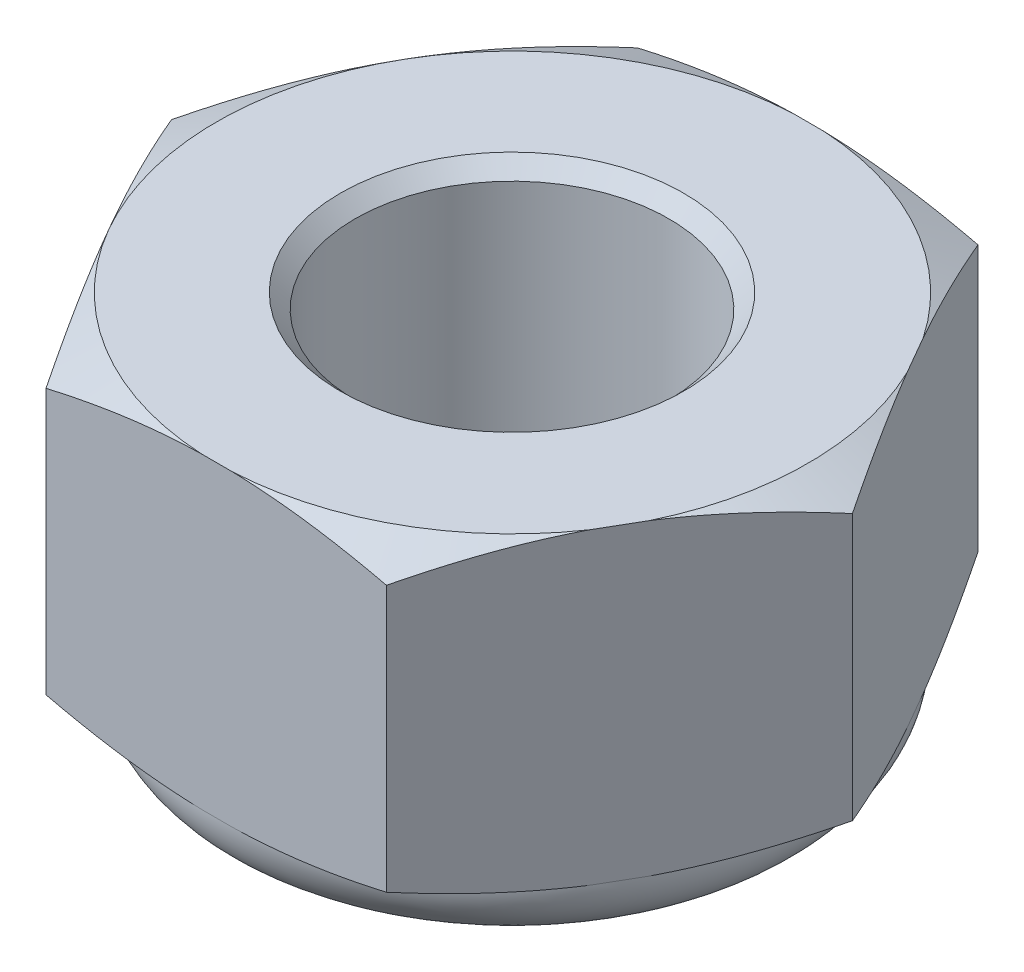
ISO-10303-21;
HEADER;
FILE_DESCRIPTION(('STEP AP214'),'2;1');
FILE_NAME('part.step','',(''),(''),'','','');
FILE_SCHEMA(('AUTOMOTIVE_DESIGN { 1 0 10303 214 1 1 1 1 }'));
ENDSEC;
DATA;
#1=APPLICATION_CONTEXT('core data for automotive mechanical design processes');
#2=APPLICATION_PROTOCOL_DEFINITION('international standard','automotive_design',2000,#1);
#3=PRODUCT_CONTEXT('',#1,'mechanical');
#4=PRODUCT('Part','Part','',(#3));
#5=PRODUCT_RELATED_PRODUCT_CATEGORY('part','',(#4));
#6=PRODUCT_DEFINITION_FORMATION('','',#4);
#7=PRODUCT_DEFINITION_CONTEXT('part definition',#1,'design');
#8=PRODUCT_DEFINITION('design','',#6,#7);
#9=PRODUCT_DEFINITION_SHAPE('','',#8);
#10=(LENGTH_UNIT() NAMED_UNIT(*) SI_UNIT(.MILLI.,.METRE.));
#11=(NAMED_UNIT(*) PLANE_ANGLE_UNIT() SI_UNIT($,.RADIAN.));
#12=(NAMED_UNIT(*) SI_UNIT($,.STERADIAN.) SOLID_ANGLE_UNIT());
#13=UNCERTAINTY_MEASURE_WITH_UNIT(LENGTH_MEASURE(1.E-05),#10,'distance_accuracy_value','');
#14=(GEOMETRIC_REPRESENTATION_CONTEXT(3) GLOBAL_UNCERTAINTY_ASSIGNED_CONTEXT((#13)) GLOBAL_UNIT_ASSIGNED_CONTEXT((#10,
#11,#12)) REPRESENTATION_CONTEXT('',''));
#15=CARTESIAN_POINT('',(0.,0.,0.));
#16=DIRECTION('',(0.,0.,1.));
#17=DIRECTION('',(1.,0.,0.));
#18=AXIS2_PLACEMENT_3D('',#15,#16,#17);
#19=CARTESIAN_POINT('',(2.42028619368284E-13,-0.5,-4.61852778244065E-13));
#20=DIRECTION('',(0.,-1.,0.));
#21=DIRECTION('',(1.,0.,0.));
#22=AXIS2_PLACEMENT_3D('',#19,#20,#21);
#23=CONICAL_SURFACE('',#22,2.22500000000005,0.785398163397449);
#24=CARTESIAN_POINT('',(2.42028619368284E-13,-0.4,-4.61852778244065E-13));
#25=DIRECTION('',(0.,1.,0.));
#26=DIRECTION('',(1.,0.,0.));
#27=AXIS2_PLACEMENT_3D('',#24,#25,#26);
#28=CIRCLE('',#27,2.12500000000005);
#29=CARTESIAN_POINT('',(-2.12499999999981,-0.4,-4.61592540799246E-13));
#30=VERTEX_POINT('',#29);
#31=EDGE_CURVE('E11',#30,#30,#28,.T.);
#32=ORIENTED_EDGE('',*,*,#31,.T.);
#33=EDGE_LOOP('',(#32));
#34=FACE_BOUND('',#33,.T.);
#35=CARTESIAN_POINT('',(2.42028619368284E-13,-0.6,-4.61852778244065E-13));
#36=DIRECTION('',(0.,-1.,0.));
#37=DIRECTION('',(1.,0.,0.));
#38=AXIS2_PLACEMENT_3D('',#35,#36,#37);
#39=CIRCLE('',#38,2.32500000000005);
#40=CARTESIAN_POINT('',(-2.3249999999998,-0.6,-4.62137508624867E-13));
#41=VERTEX_POINT('',#40);
#42=EDGE_CURVE('E27',#41,#41,#39,.T.);
#43=ORIENTED_EDGE('',*,*,#42,.T.);
#44=EDGE_LOOP('',(#43));
#45=FACE_BOUND('',#44,.T.);
#46=ADVANCED_FACE('F16',(#34,#45),#23,.F.);
#47=CARTESIAN_POINT('',(2.42028619368284E-13,0.,-4.61852778244065E-13));
#48=DIRECTION('',(0.,-1.,0.));
#49=DIRECTION('',(1.,0.,0.));
#50=AXIS2_PLACEMENT_3D('',#47,#48,#49);
#51=CYLINDRICAL_SURFACE('',#50,2.12500000000005);
#52=CARTESIAN_POINT('',(2.42028619368284E-13,3.97,-4.61852778244065E-13));
#53=DIRECTION('',(0.,-1.,0.));
#54=DIRECTION('',(1.,0.,0.));
#55=AXIS2_PLACEMENT_3D('',#52,#53,#54);
#56=CIRCLE('',#55,2.12500000000005);
#57=CARTESIAN_POINT('',(-2.12499999999981,3.97,-4.62113015688884E-13));
#58=VERTEX_POINT('',#57);
#59=EDGE_CURVE('E265',#58,#58,#56,.T.);
#60=ORIENTED_EDGE('',*,*,#59,.F.);
#61=EDGE_LOOP('',(#60));
#62=FACE_BOUND('',#61,.T.);
#63=ORIENTED_EDGE('',*,*,#31,.F.);
#64=EDGE_LOOP('',(#63));
#65=FACE_BOUND('',#64,.T.);
#66=ADVANCED_FACE('F496',(#62,#65),#51,.F.);
#67=CARTESIAN_POINT('',(1.53329039358869E-13,-0.6,-4.97397371368949E-13));
#68=DIRECTION('',(0.,1.,0.));
#69=DIRECTION('',(0.,0.,1.));
#70=AXIS2_PLACEMENT_3D('',#67,#68,#69);
#71=PLANE('',#70);
#72=CARTESIAN_POINT('',(1.53210777398272E-13,-0.6,-4.9737991503207E-13));
#73=DIRECTION('',(0.,1.,0.));
#74=DIRECTION('',(1.,0.,0.));
#75=AXIS2_PLACEMENT_3D('',#72,#73,#74);
#76=CIRCLE('',#75,2.64999999999992);
#77=CARTESIAN_POINT('',(-2.64999999999976,-0.6,-4.97055383630296E-13));
#78=VERTEX_POINT('',#77);
#79=EDGE_CURVE('E254',#78,#78,#76,.T.);
#80=ORIENTED_EDGE('',*,*,#79,.F.);
#81=EDGE_LOOP('',(#80));
#82=FACE_BOUND('',#81,.T.);
#83=ORIENTED_EDGE('',*,*,#42,.F.);
#84=EDGE_LOOP('',(#83));
#85=FACE_BOUND('',#84,.T.);
#86=ADVANCED_FACE('F501',(#82,#85),#71,.F.);
#87=CARTESIAN_POINT('',(2.42028619368284E-13,4.07,-4.61852778244065E-13));
#88=DIRECTION('',(0.,1.,0.));
#89=DIRECTION('',(1.,0.,0.));
#90=AXIS2_PLACEMENT_3D('',#87,#88,#89);
#91=CONICAL_SURFACE('',#90,2.22500000000005,0.785398163397448);
#92=ORIENTED_EDGE('',*,*,#59,.T.);
#93=EDGE_LOOP('',(#92));
#94=FACE_BOUND('',#93,.T.);
#95=CARTESIAN_POINT('',(2.42028619368284E-13,4.17,-4.61852778244065E-13));
#96=DIRECTION('',(0.,1.,0.));
#97=DIRECTION('',(1.,0.,0.));
#98=AXIS2_PLACEMENT_3D('',#95,#96,#97);
#99=CIRCLE('',#98,2.32500000000005);
#100=CARTESIAN_POINT('',(-2.3249999999998,4.17,-4.61568047863263E-13));
#101=VERTEX_POINT('',#100);
#102=EDGE_CURVE('E261',#101,#101,#99,.T.);
#103=ORIENTED_EDGE('',*,*,#102,.T.);
#104=EDGE_LOOP('',(#103));
#105=FACE_BOUND('',#104,.T.);
#106=ADVANCED_FACE('F788',(#94,#105),#91,.F.);
#107=CARTESIAN_POINT('',(-3.95168422103907,4.17,-0.00623584935142605));
#108=DIRECTION('',(0.,1.,0.));
#109=DIRECTION('',(0.,0.,1.));
#110=AXIS2_PLACEMENT_3D('',#107,#108,#109);
#111=PLANE('',#110);
#112=CARTESIAN_POINT('',(0.00631208491232327,4.17,0.));
#113=DIRECTION('',(0.,1.,0.));
#114=DIRECTION('',(-1.,0.,0.));
#115=AXIS2_PLACEMENT_3D('',#112,#113,#114);
#116=CIRCLE('',#115,4.00534598764084);
#117=CARTESIAN_POINT('',(-3.465683941561,4.17,1.99725930299725));
#118=VERTEX_POINT('',#117);
#119=CARTESIAN_POINT('',(-0.206680177830518,4.17,3.99967883419684));
#120=VERTEX_POINT('',#119);
#121=EDGE_CURVE('E266',#118,#120,#116,.T.);
#122=ORIENTED_EDGE('',*,*,#121,.T.);
#123=DIRECTION('',(0.999998754923727,0.,0.00157802122802851));
#124=VECTOR('',#123,1.);
#125=CARTESIAN_POINT('',(-2.3157102862899,4.17,3.99635073577141));
#126=LINE('',#125,#124);
#127=CARTESIAN_POINT('',(0.206680146394848,4.17,4.00033112637545));
#128=VERTEX_POINT('',#127);
#129=EDGE_CURVE('E539',#120,#128,#126,.T.);
#130=ORIENTED_EDGE('',*,*,#129,.T.);
#131=CARTESIAN_POINT('',(0.00631208491232327,4.17,0.));
#132=DIRECTION('',(0.,1.,0.));
#133=DIRECTION('',(-1.,0.,0.));
#134=AXIS2_PLACEMENT_3D('',#131,#132,#133);
#135=CIRCLE('',#134,4.00534598764084);
#136=CARTESIAN_POINT('',(3.31510741865947,4.17,2.25713755010271));
#137=VERTEX_POINT('',#136);
#138=EDGE_CURVE('E228',#128,#137,#135,.T.);
#139=ORIENTED_EDGE('',*,*,#138,.T.);
#140=DIRECTION('',(0.501365983932784,0.,-0.865235314902895));
#141=VECTOR('',#140,1.);
#142=CARTESIAN_POINT('',(2.30308611646648,4.17,4.00363930361773));
#143=LINE('',#142,#141);
#144=CARTESIAN_POINT('',(3.60994841098794,4.17,1.74831396210715));
#145=VERTEX_POINT('',#144);
#146=EDGE_CURVE('E173',#137,#145,#143,.T.);
#147=ORIENTED_EDGE('',*,*,#146,.T.);
#148=CARTESIAN_POINT('',(0.00631208491232327,4.17,0.));
#149=DIRECTION('',(0.,1.,0.));
#150=DIRECTION('',(-1.,0.,0.));
#151=AXIS2_PLACEMENT_3D('',#148,#149,#150);
#152=CIRCLE('',#151,4.00534598764084);
#153=CARTESIAN_POINT('',(3.6155070334328,4.17,-1.73680980659508));
#154=VERTEX_POINT('',#153);
#155=EDGE_CURVE('E165',#145,#154,#152,.T.);
#156=ORIENTED_EDGE('',*,*,#155,.T.);
#157=DIRECTION('',(-0.498632770990459,0.,-0.866813336130898));
#158=VECTOR('',#157,1.);
#159=CARTESIAN_POINT('',(4.61879640275538,4.17,0.00728856784530948));
#160=LINE('',#159,#158);
#161=CARTESIAN_POINT('',(3.32213846153878,4.17,-2.24679592326024));
#162=VERTEX_POINT('',#161);
#163=EDGE_CURVE('E151',#154,#162,#160,.T.);
#164=ORIENTED_EDGE('',*,*,#163,.T.);
#165=CARTESIAN_POINT('',(0.00631208491232327,4.17,0.));
#166=DIRECTION('',(0.,1.,0.));
#167=DIRECTION('',(-1.,0.,0.));
#168=AXIS2_PLACEMENT_3D('',#165,#166,#167);
#169=CIRCLE('',#168,4.00534598764084);
#170=CARTESIAN_POINT('',(0.219689502888317,4.17,-3.99965830518164));
#171=VERTEX_POINT('',#170);
#172=EDGE_CURVE('E166',#162,#171,#169,.T.);
#173=ORIENTED_EDGE('',*,*,#172,.T.);
#174=DIRECTION('',(-0.999998754923727,0.,-0.00157802122796831));
#175=VECTOR('',#174,1.);
#176=CARTESIAN_POINT('',(2.31571028629069,4.17,-3.99635073577299));
#177=LINE('',#176,#175);
#178=CARTESIAN_POINT('',(-0.19444119467601,4.17,-4.00031181302721));
#179=VERTEX_POINT('',#178);
#180=EDGE_CURVE('E256',#171,#179,#177,.T.);
#181=ORIENTED_EDGE('',*,*,#180,.T.);
#182=CARTESIAN_POINT('',(0.00631208491232327,4.17,0.));
#183=DIRECTION('',(0.,1.,0.));
#184=DIRECTION('',(-1.,0.,0.));
#185=AXIS2_PLACEMENT_3D('',#182,#183,#184);
#186=CIRCLE('',#185,4.00534598764084);
#187=CARTESIAN_POINT('',(-3.45935460439868,4.17,-2.00820211535777));
#188=VERTEX_POINT('',#187);
#189=EDGE_CURVE('E260',#179,#188,#186,.T.);
#190=ORIENTED_EDGE('',*,*,#189,.T.);
#191=CARTESIAN_POINT('',(0.00631208491232327,4.17,0.));
#192=DIRECTION('',(0.,1.,0.));
#193=DIRECTION('',(-1.,0.,0.));
#194=AXIS2_PLACEMENT_3D('',#191,#192,#193);
#195=CIRCLE('',#194,4.00534598764084);
#196=EDGE_CURVE('E318',#188,#118,#195,.T.);
#197=ORIENTED_EDGE('',*,*,#196,.T.);
#198=EDGE_LOOP('',(#122,#130,#139,#147,#156,#164,#173,#181,#190,#197));
#199=FACE_BOUND('',#198,.T.);
#200=ORIENTED_EDGE('',*,*,#102,.F.);
#201=EDGE_LOOP('',(#200));
#202=FACE_BOUND('',#201,.T.);
#203=ADVANCED_FACE('F170',(#199,#202),#111,.T.);
#204=CARTESIAN_POINT('',(0.00631208491232327,0.1445,0.));
#205=DIRECTION('',(0.,1.,0.));
#206=DIRECTION('',(-1.,0.,0.));
#207=AXIS2_PLACEMENT_3D('',#204,#205,#206);
#208=CONICAL_SURFACE('',#207,4.31522723765447,1.13446401379631);
#209=CARTESIAN_POINT('',(-3.4609412033314,5.44186762644373E-05,-2.0054640328568));
#210=CARTESIAN_POINT('',(-3.99830108829386,0.000449278117987922,-1.07811203016529));
#211=CARTESIAN_POINT('',(-4.61879064416441,0.289,-0.00729850576919097));
#212=(BOUNDED_CURVE() B_SPLINE_CURVE(2,(#209,#210,#211),.UNSPECIFIED.,.F.,
.F.) B_SPLINE_CURVE_WITH_KNOTS((3,3),(0.233779761454179,0.466896325796484),
.UNSPECIFIED.) CURVE() GEOMETRIC_REPRESENTATION_ITEM() RATIONAL_B_SPLINE_CURVE((1.00010767183527,
1.03790093727743,1.)) REPRESENTATION_ITEM(''));
#213=CARTESIAN_POINT('',(-3.46094125961105,0.,-2.00546393573187));
#214=VERTEX_POINT('',#213);
#215=CARTESIAN_POINT('',(-4.61879064416441,0.289,-0.00729850576919128));
#216=VERTEX_POINT('',#215);
#217=EDGE_CURVE('E574',#214,#216,#212,.T.);
#218=ORIENTED_EDGE('',*,*,#217,.F.);
#219=CARTESIAN_POINT('',(0.00631208491232327,5.44187176203736E-05,0.));
#220=DIRECTION('',(0.,1.,0.));
#221=DIRECTION('',(-0.86563116767564,0.,-0.500682216129661));
#222=AXIS2_PLACEMENT_3D('',#219,#220,#221);
#223=CIRCLE('',#222,4.00546268895738);
#224=CARTESIAN_POINT('',(-3.99903390272852,0.,0.));
#225=VERTEX_POINT('',#224);
#226=EDGE_CURVE('E428',#214,#225,#223,.T.);
#227=ORIENTED_EDGE('',*,*,#226,.T.);
#228=CARTESIAN_POINT('',(0.00631208491232327,0.000450498556113369,0.));
#229=DIRECTION('',(0.,1.,0.));
#230=DIRECTION('',(-1.,0.,0.));
#231=AXIS2_PLACEMENT_3D('',#228,#229,#230);
#232=CIRCLE('',#231,4.0063120849121);
#233=CARTESIAN_POINT('',(-3.46725334452284,0.,1.99453108396267));
#234=VERTEX_POINT('',#233);
#235=EDGE_CURVE('E418',#225,#234,#232,.T.);
#236=ORIENTED_EDGE('',*,*,#235,.T.);
#237=CARTESIAN_POINT('',(-4.61879067551483,0.289,-0.00727861172378634));
#238=CARTESIAN_POINT('',(-4.00168444748494,0.000451762253089658,1.06548663634209));
#239=CARTESIAN_POINT('',(-3.46725328411033,5.90570388239081E-05,1.9945311889826));
#240=(BOUNDED_CURVE() B_SPLINE_CURVE(2,(#237,#238,#239),.UNSPECIFIED.,.F.,
.F.) B_SPLINE_CURVE_WITH_KNOTS((3,3),(0.,0.233116595104557),
.UNSPECIFIED.) CURVE() GEOMETRIC_REPRESENTATION_ITEM() RATIONAL_B_SPLINE_CURVE((1.,
1.03790054036081,1.00010708410972)) REPRESENTATION_ITEM(''));
#241=EDGE_CURVE('E328',#216,#234,#240,.T.);
#242=ORIENTED_EDGE('',*,*,#241,.F.);
#243=EDGE_LOOP('',(#218,#227,#236,#242));
#244=FACE_BOUND('',#243,.T.);
#245=ADVANCED_FACE('F351',(#244),#208,.T.);
#246=CARTESIAN_POINT('',(0.00631208491232327,0.1445,0.));
#247=DIRECTION('',(0.,1.,0.));
#248=DIRECTION('',(-1.,0.,0.));
#249=AXIS2_PLACEMENT_3D('',#246,#247,#248);
#250=CONICAL_SURFACE('',#249,4.31522723765447,1.13446401379631);
#251=CARTESIAN_POINT('',(-2.3157102862899,0.287536520087993,3.99635073577142));
#252=CARTESIAN_POINT('',(-1.18582540108418,0.0235602283512674,3.99813372032545));
#253=CARTESIAN_POINT('',(-0.206680177830519,0.,3.99967883419684));
#254=(BOUNDED_CURVE() B_SPLINE_CURVE(2,(#251,#252,#253),.UNSPECIFIED.,.F.,
.F.) B_SPLINE_CURVE_WITH_KNOTS((3,3),(0.000572315796720624,0.213783986526458),
.UNSPECIFIED.) CURVE() GEOMETRIC_REPRESENTATION_ITEM() RATIONAL_B_SPLINE_CURVE((1.00016799488598,
1.0313765727307,1.)) REPRESENTATION_ITEM(''));
#255=CARTESIAN_POINT('',(-2.3157102862899,0.287536520087993,3.99635073577141));
#256=VERTEX_POINT('',#255);
#257=CARTESIAN_POINT('',(-0.206680177830525,0.,3.99967883419684));
#258=VERTEX_POINT('',#257);
#259=EDGE_CURVE('E280',#256,#258,#254,.T.);
#260=ORIENTED_EDGE('',*,*,#259,.F.);
#261=CARTESIAN_POINT('',(-3.46725328411033,5.90570388239081E-05,1.9945311889826));
#262=CARTESIAN_POINT('',(-3.46646861271456,5.84804546541894E-05,1.99589524620047));
#263=CARTESIAN_POINT('',(-3.465683941561,5.84804546541889E-05,1.99725930299725));
#264=CARTESIAN_POINT('',(-2.93178445166088,5.84804545016721E-05,2.92537960499687));
#265=CARTESIAN_POINT('',(-2.31571028628989,0.287536520087993,3.99635073577141));
#266=(BOUNDED_CURVE() B_SPLINE_CURVE(2,(#261,#262,#263,#264,#265),.UNSPECIFIED.,.F.,
.F.) B_SPLINE_CURVE_WITH_KNOTS((3,2,3),(0.233116595104557,0.233446384574875,0.466322360007904),
.UNSPECIFIED.) CURVE() GEOMETRIC_REPRESENTATION_ITEM() RATIONAL_B_SPLINE_CURVE((1.00010708410972,
1.00005361780067,1.,1.03786141995599,1.00018502321298)) REPRESENTATION_ITEM(''));
#267=EDGE_CURVE('E275',#234,#256,#266,.T.);
#268=ORIENTED_EDGE('',*,*,#267,.F.);
#269=CARTESIAN_POINT('',(-3.38688712938945,0.,2.12814369175916));
#270=CARTESIAN_POINT('',(-3.39034380699885,0.,2.12264247658681));
#271=CARTESIAN_POINT('',(-3.39378708120445,0.,2.11713283941409));
#272=CARTESIAN_POINT('',(-3.40064674155366,0.,2.10609685220267));
#273=CARTESIAN_POINT('',(-3.40406312769727,0.,2.10057050216398));
#274=CARTESIAN_POINT('',(-3.41086893066809,0.,2.08950122035544));
#275=CARTESIAN_POINT('',(-3.4142583474953,0.,2.08395828858559));
#276=CARTESIAN_POINT('',(-3.42101013139119,0.,2.07285597495007));
#277=CARTESIAN_POINT('',(-3.42437249845987,0.,2.06729659308439));
#278=CARTESIAN_POINT('',(-3.43107010298968,0.,2.05616151125271));
#279=CARTESIAN_POINT('',(-3.4344053404508,0.,2.05058581128671));
#280=CARTESIAN_POINT('',(-3.44104860658541,0.,2.03941822565224));
#281=CARTESIAN_POINT('',(-3.44435663525889,0.,2.03382633998377));
#282=CARTESIAN_POINT('',(-3.45094540523426,0.,2.02262651569737));
#283=CARTESIAN_POINT('',(-3.45422614653614,0.,2.01701857707944));
#284=CARTESIAN_POINT('',(-3.46076026400719,0.,2.00578678013009));
#285=CARTESIAN_POINT('',(-3.46401364017636,0.,2.00016292179866));
#286=CARTESIAN_POINT('',(-3.4672532948986,0.,1.99453117022847));
#287=B_SPLINE_CURVE_WITH_KNOTS('',3,(#269,#270,#271,#272,#273,#274,#275,#276,#277,#278,#279,
#280,#281,#282,#283,#284,#285,#286),.UNSPECIFIED.,.F.,.F.,(4,2,2,2,2,2,2,2,4),(0.,
0.0194912068486608,0.0389824136973243,0.0584736205459855,0.0779648273946492,0.0974560342433096,
0.11694724109197,0.136438447940635,0.155929654789295),.UNSPECIFIED.);
#288=CARTESIAN_POINT('',(-3.38688712938925,0.,2.12814369175902));
#289=VERTEX_POINT('',#288);
#290=EDGE_CURVE('E181',#289,#234,#287,.T.);
#291=ORIENTED_EDGE('',*,*,#290,.F.);
#292=CARTESIAN_POINT('',(0.00631208491232327,0.,0.));
#293=DIRECTION('',(0.,-1.,0.));
#294=DIRECTION('',(-1.,0.,0.));
#295=AXIS2_PLACEMENT_3D('',#292,#293,#294);
#296=CIRCLE('',#295,4.00534598764084);
#297=EDGE_CURVE('E438',#258,#289,#296,.T.);
#298=ORIENTED_EDGE('',*,*,#297,.F.);
#299=EDGE_LOOP('',(#260,#268,#291,#298));
#300=FACE_BOUND('',#299,.T.);
#301=ADVANCED_FACE('F458',(#300),#250,.T.);
#302=CARTESIAN_POINT('',(0.00631208491232327,0.1445,0.));
#303=DIRECTION('',(0.,1.,0.));
#304=DIRECTION('',(-1.,0.,0.));
#305=AXIS2_PLACEMENT_3D('',#302,#303,#304);
#306=CONICAL_SURFACE('',#305,4.31522723765447,1.13446401379631);
#307=CARTESIAN_POINT('',(0.206680146394849,0.,4.00033112637545));
#308=CARTESIAN_POINT('',(1.18067705769313,0.0234363494797663,4.00186811609119));
#309=CARTESIAN_POINT('',(2.30308611646648,0.284593157777823,4.00363930361772));
#310=(BOUNDED_CURVE() B_SPLINE_CURVE(2,(#307,#308,#309),.UNSPECIFIED.,.F.,
.F.) B_SPLINE_CURVE_WITH_KNOTS((3,3),(0.,0.212055626798938),
.UNSPECIFIED.) CURVE() GEOMETRIC_REPRESENTATION_ITEM() RATIONAL_B_SPLINE_CURVE((1.,
1.03120644744463,1.00050458378926)) REPRESENTATION_ITEM(''));
#311=CARTESIAN_POINT('',(0.206680146394855,0.,4.00033112637545));
#312=VERTEX_POINT('',#311);
#313=CARTESIAN_POINT('',(2.30308611646648,0.284593157777823,4.00363930361773));
#314=VERTEX_POINT('',#313);
#315=EDGE_CURVE('E249',#312,#314,#310,.T.);
#316=ORIENTED_EDGE('',*,*,#315,.F.);
#317=CARTESIAN_POINT('',(0.00631208491232327,0.,0.));
#318=DIRECTION('',(0.,-1.,0.));
#319=DIRECTION('',(-1.,0.,0.));
#320=AXIS2_PLACEMENT_3D('',#317,#318,#319);
#321=CIRCLE('',#320,4.00534598764084);
#322=CARTESIAN_POINT('',(3.31510741865948,0.,2.2571375501027));
#323=VERTEX_POINT('',#322);
#324=EDGE_CURVE('E195',#323,#312,#321,.T.);
#325=ORIENTED_EDGE('',*,*,#324,.F.);
#326=CARTESIAN_POINT('',(2.30308611646648,0.284593157777823,4.00363930361773));
#327=CARTESIAN_POINT('',(2.84491908845245,0.0321035083041493,3.06856784451391));
#328=CARTESIAN_POINT('',(3.31510741865948,0.,2.2571375501027));
#329=(BOUNDED_CURVE() B_SPLINE_CURVE(2,(#326,#327,#328),.UNSPECIFIED.,.F.,
.F.) B_SPLINE_CURVE_WITH_KNOTS((3,3),(0.00172631156148343,0.206026949849234),
.UNSPECIFIED.) CURVE() GEOMETRIC_REPRESENTATION_ITEM() RATIONAL_B_SPLINE_CURVE((1.00048331406831,
1.02884060025309,1.)) REPRESENTATION_ITEM(''));
#330=EDGE_CURVE('E230',#314,#323,#329,.T.);
#331=ORIENTED_EDGE('',*,*,#330,.F.);
#332=EDGE_LOOP('',(#316,#325,#331));
#333=FACE_BOUND('',#332,.T.);
#334=ADVANCED_FACE('F468',(#333),#306,.T.);
#335=CARTESIAN_POINT('',(0.00631208491232327,0.1445,0.));
#336=DIRECTION('',(0.,1.,0.));
#337=DIRECTION('',(-1.,0.,0.));
#338=AXIS2_PLACEMENT_3D('',#335,#336,#337);
#339=CONICAL_SURFACE('',#338,4.31522723765447,1.13446401379631);
#340=CARTESIAN_POINT('',(3.60994841098793,0.,1.74831396210716));
#341=CARTESIAN_POINT('',(4.07883470981083,0.0320146082343961,0.93913065606525));
#342=CARTESIAN_POINT('',(4.61879640275538,0.283115938226351,0.00728856784530948));
#343=(BOUNDED_CURVE() B_SPLINE_CURVE(2,(#340,#341,#342),.UNSPECIFIED.,.F.,
.F.) B_SPLINE_CURVE_WITH_KNOTS((3,3),(0.,0.203718625213286),
.UNSPECIFIED.) CURVE() GEOMETRIC_REPRESENTATION_ITEM() RATIONAL_B_SPLINE_CURVE((1.,
1.0287584389512,1.00064441873426)) REPRESENTATION_ITEM(''));
#344=CARTESIAN_POINT('',(3.60994841098793,0.,1.74831396210716));
#345=VERTEX_POINT('',#344);
#346=CARTESIAN_POINT('',(4.61879640275538,0.283115938226351,0.00728856784530948));
#347=VERTEX_POINT('',#346);
#348=EDGE_CURVE('E395',#345,#347,#343,.T.);
#349=ORIENTED_EDGE('',*,*,#348,.F.);
#350=CARTESIAN_POINT('',(0.00631208491232327,0.,0.));
#351=DIRECTION('',(0.,-1.,0.));
#352=DIRECTION('',(-1.,0.,0.));
#353=AXIS2_PLACEMENT_3D('',#350,#351,#352);
#354=CIRCLE('',#353,4.00534598764084);
#355=CARTESIAN_POINT('',(3.6155070334328,0.,-1.73680980659507));
#356=VERTEX_POINT('',#355);
#357=EDGE_CURVE('E250',#356,#345,#354,.T.);
#358=ORIENTED_EDGE('',*,*,#357,.F.);
#359=CARTESIAN_POINT('',(4.61879640275537,0.283115938226351,0.00728856784530948));
#360=CARTESIAN_POINT('',(4.08180982916505,0.0320274591462295,-0.926198259317594));
#361=CARTESIAN_POINT('',(3.6155070334328,0.,-1.73680980659508));
#362=(BOUNDED_CURVE() B_SPLINE_CURVE(2,(#359,#360,#361),.UNSPECIFIED.,.F.,
.F.) B_SPLINE_CURVE_WITH_KNOTS((3,3),(0.00230831763025471,0.206015193233765),
.UNSPECIFIED.) CURVE() GEOMETRIC_REPRESENTATION_ITEM() RATIONAL_B_SPLINE_CURVE((1.0006443750767,
1.02875493697249,1.)) REPRESENTATION_ITEM(''));
#363=EDGE_CURVE('E302',#347,#356,#362,.T.);
#364=ORIENTED_EDGE('',*,*,#363,.F.);
#365=EDGE_LOOP('',(#349,#358,#364));
#366=FACE_BOUND('',#365,.T.);
#367=ADVANCED_FACE('F476',(#366),#339,.T.);
#368=CARTESIAN_POINT('',(0.00631208491232327,0.1445,0.));
#369=DIRECTION('',(0.,1.,0.));
#370=DIRECTION('',(-1.,0.,0.));
#371=AXIS2_PLACEMENT_3D('',#368,#369,#370);
#372=CONICAL_SURFACE('',#371,4.31522723765447,1.13446401379631);
#373=CARTESIAN_POINT('',(3.32213846153878,0.,-2.24679592326024));
#374=CARTESIAN_POINT('',(2.85454777960211,0.0321159160956089,-3.05964630641527));
#375=CARTESIAN_POINT('',(2.31571028629069,0.284585107416631,-3.99635073577299));
#376=(BOUNDED_CURVE() B_SPLINE_CURVE(2,(#373,#374,#375),.UNSPECIFIED.,.F.,
.F.) B_SPLINE_CURVE_WITH_KNOTS((3,3),(0.,0.204285719668057),
.UNSPECIFIED.) CURVE() GEOMETRIC_REPRESENTATION_ITEM() RATIONAL_B_SPLINE_CURVE((1.,
1.02883664567546,1.00048416056735)) REPRESENTATION_ITEM(''));
#377=CARTESIAN_POINT('',(3.32213846153878,0.,-2.24679592326024));
#378=VERTEX_POINT('',#377);
#379=CARTESIAN_POINT('',(2.31571028629069,0.284585107416631,-3.99635073577299));
#380=VERTEX_POINT('',#379);
#381=EDGE_CURVE('E226',#378,#380,#376,.T.);
#382=ORIENTED_EDGE('',*,*,#381,.F.);
#383=CARTESIAN_POINT('',(0.00631208491232327,0.,0.));
#384=DIRECTION('',(0.,-1.,0.));
#385=DIRECTION('',(-1.,0.,0.));
#386=AXIS2_PLACEMENT_3D('',#383,#384,#385);
#387=CIRCLE('',#386,4.00534598764084);
#388=CARTESIAN_POINT('',(0.219689502888322,0.,-3.99965830518164));
#389=VERTEX_POINT('',#388);
#390=EDGE_CURVE('E634',#389,#378,#387,.T.);
#391=ORIENTED_EDGE('',*,*,#390,.F.);
#392=CARTESIAN_POINT('',(2.31571028629069,0.284585107416631,-3.99635073577299));
#393=CARTESIAN_POINT('',(1.19350940535971,0.023475760316561,-3.99812159479));
#394=CARTESIAN_POINT('',(0.219689502888322,0.,-3.99965830518164));
#395=(BOUNDED_CURVE() B_SPLINE_CURVE(2,(#392,#393,#394),.UNSPECIFIED.,.F.,
.F.) B_SPLINE_CURVE_WITH_KNOTS((3,3),(0.00173152759157111,0.213749054711608),
.UNSPECIFIED.) CURVE() GEOMETRIC_REPRESENTATION_ITEM() RATIONAL_B_SPLINE_CURVE((1.00050540730618,
1.03119509457027,1.)) REPRESENTATION_ITEM(''));
#396=EDGE_CURVE('E673',#380,#389,#395,.T.);
#397=ORIENTED_EDGE('',*,*,#396,.F.);
#398=EDGE_LOOP('',(#382,#391,#397));
#399=FACE_BOUND('',#398,.T.);
#400=ADVANCED_FACE('F472',(#399),#372,.T.);
#401=CARTESIAN_POINT('',(0.00631208491232327,0.1445,0.));
#402=DIRECTION('',(0.,1.,0.));
#403=DIRECTION('',(-1.,0.,0.));
#404=AXIS2_PLACEMENT_3D('',#401,#402,#403);
#405=CONICAL_SURFACE('',#404,4.31522723765447,1.13446401379631);
#406=CARTESIAN_POINT('',(-0.194441194676013,0.,-4.00031181302721));
#407=CARTESIAN_POINT('',(-1.17340954623546,0.0235998733649238,-4.00185664779092));
#408=CARTESIAN_POINT('',(-2.30308611646555,0.287528480720802,-4.00363930361903));
#409=(BOUNDED_CURVE() B_SPLINE_CURVE(2,(#406,#407,#408),.UNSPECIFIED.,.F.,
.F.) B_SPLINE_CURVE_WITH_KNOTS((3,3),(0.,0.213173591475686),
.UNSPECIFIED.) CURVE() GEOMETRIC_REPRESENTATION_ITEM() RATIONAL_B_SPLINE_CURVE((1.,
1.03136519153064,1.00016888509414)) REPRESENTATION_ITEM(''));
#410=CARTESIAN_POINT('',(-0.194441194676013,0.,-4.00031181302721));
#411=VERTEX_POINT('',#410);
#412=CARTESIAN_POINT('',(-2.30308611646555,0.287528480720802,-4.00363930361903));
#413=VERTEX_POINT('',#412);
#414=EDGE_CURVE('E212',#411,#413,#409,.T.);
#415=ORIENTED_EDGE('',*,*,#414,.F.);
#416=CARTESIAN_POINT('',(0.00631208491232327,0.,0.));
#417=DIRECTION('',(0.,-1.,0.));
#418=DIRECTION('',(-1.,0.,0.));
#419=AXIS2_PLACEMENT_3D('',#416,#417,#418);
#420=CIRCLE('',#419,4.00534598764084);
#421=CARTESIAN_POINT('',(-3.38688712924206,0.,-2.128143691994));
#422=VERTEX_POINT('',#421);
#423=EDGE_CURVE('E376',#422,#411,#420,.T.);
#424=ORIENTED_EDGE('',*,*,#423,.F.);
#425=CARTESIAN_POINT('',(0.00631208491232327,0.,0.));
#426=DIRECTION('',(0.,1.,0.));
#427=DIRECTION('',(-0.847167566703236,0.,-0.531325807698175));
#428=AXIS2_PLACEMENT_3D('',#425,#426,#427);
#429=CIRCLE('',#428,4.00534598764099);
#430=EDGE_CURVE('E431',#422,#214,#429,.T.);
#431=ORIENTED_EDGE('',*,*,#430,.T.);
#432=CARTESIAN_POINT('',(-2.30308611646555,0.287528480720803,-4.00363930361903));
#433=CARTESIAN_POINT('',(-2.92253224827303,5.38357488031466E-05,-2.93462647447694));
#434=CARTESIAN_POINT('',(-3.45935460439868,5.38357488036149E-05,-2.00820211535777));
#435=CARTESIAN_POINT('',(-3.46014790374125,5.3835748803615E-05,-2.00683307432092));
#436=CARTESIAN_POINT('',(-3.4609412033314,5.44186762644373E-05,-2.0054640328568));
#437=(BOUNDED_CURVE() B_SPLINE_CURVE(2,(#432,#433,#434,#435,#436),.UNSPECIFIED.,.F.,
.F.) B_SPLINE_CURVE_WITH_KNOTS((3,2,3),(0.000573541922099044,0.233448162898242,
0.233779761454179),
.UNSPECIFIED.) CURVE() GEOMETRIC_REPRESENTATION_ITEM() RATIONAL_B_SPLINE_CURVE((1.00018603886433,
1.03786160124667,1.,1.00005391249697,1.00010767183527)) REPRESENTATION_ITEM(''));
#438=EDGE_CURVE('E452',#413,#214,#437,.T.);
#439=ORIENTED_EDGE('',*,*,#438,.F.);
#440=EDGE_LOOP('',(#415,#424,#431,#439));
#441=FACE_BOUND('',#440,.T.);
#442=ADVANCED_FACE('F475',(#441),#405,.T.);
#443=CARTESIAN_POINT('',(0.00631208491232327,4.0255,0.));
#444=DIRECTION('',(0.,-1.,0.));
#445=DIRECTION('',(-1.,0.,0.));
#446=AXIS2_PLACEMENT_3D('',#443,#444,#445);
#447=CONICAL_SURFACE('',#446,4.31522723765447,1.13446401379631);
#448=CARTESIAN_POINT('',(-3.465683941561,4.16994151954535,1.99725930299725));
#449=CARTESIAN_POINT('',(-4.00084335190563,4.16994151954535,1.06694878024341));
#450=CARTESIAN_POINT('',(-4.61879067551483,3.881,-0.00727861172378545));
#451=(BOUNDED_CURVE() B_SPLINE_CURVE(2,(#448,#449,#450),.UNSPECIFIED.,.F.,
.F.) B_SPLINE_CURVE_WITH_KNOTS((3,3),(0.233446384574874,0.466892769149748),
.UNSPECIFIED.) CURVE() GEOMETRIC_REPRESENTATION_ITEM() RATIONAL_B_SPLINE_CURVE((1.,
1.03795415816151,1.)) REPRESENTATION_ITEM(''));
#452=CARTESIAN_POINT('',(-4.61879064416441,3.881,-0.00729850576919128));
#453=VERTEX_POINT('',#452);
#454=EDGE_CURVE('E324',#118,#453,#451,.T.);
#455=ORIENTED_EDGE('',*,*,#454,.F.);
#456=ORIENTED_EDGE('',*,*,#196,.F.);
#457=CARTESIAN_POINT('',(-4.61879064416441,3.881,-0.00729850576919365));
#458=CARTESIAN_POINT('',(-3.99745074261311,4.1699461642512,-1.07957951925796));
#459=CARTESIAN_POINT('',(-3.45935460439868,4.1699461642512,-2.00820211535777));
#460=(BOUNDED_CURVE() B_SPLINE_CURVE(2,(#457,#458,#459),.UNSPECIFIED.,.F.,
.F.) B_SPLINE_CURVE_WITH_KNOTS((3,3),(0.,0.233448162898241),
.UNSPECIFIED.) CURVE() GEOMETRIC_REPRESENTATION_ITEM() RATIONAL_B_SPLINE_CURVE((1.,
1.0379548497744,1.)) REPRESENTATION_ITEM(''));
#461=EDGE_CURVE('E527',#453,#188,#460,.T.);
#462=ORIENTED_EDGE('',*,*,#461,.F.);
#463=EDGE_LOOP('',(#455,#456,#462));
#464=FACE_BOUND('',#463,.T.);
#465=ADVANCED_FACE('F511',(#464),#447,.T.);
#466=CARTESIAN_POINT('',(0.00631208491232327,4.0255,0.));
#467=DIRECTION('',(0.,-1.,0.));
#468=DIRECTION('',(-1.,0.,0.));
#469=AXIS2_PLACEMENT_3D('',#466,#467,#468);
#470=CONICAL_SURFACE('',#469,4.31522723765447,1.13446401379631);
#471=CARTESIAN_POINT('',(-2.30308611646555,3.8824715192792,-4.00363930361903));
#472=CARTESIAN_POINT('',(-1.17340954623587,4.14640012663492,-4.00185664779092));
#473=CARTESIAN_POINT('',(-0.194441194676025,4.17,-4.00031181302721));
#474=(BOUNDED_CURVE() B_SPLINE_CURVE(2,(#471,#472,#473),.UNSPECIFIED.,.F.,
.F.) B_SPLINE_CURVE_WITH_KNOTS((3,3),(0.00057546323598649,0.213749054711607),
.UNSPECIFIED.) CURVE() GEOMETRIC_REPRESENTATION_ITEM() RATIONAL_B_SPLINE_CURVE((1.00016888509416,
1.03136519153063,1.)) REPRESENTATION_ITEM(''));
#475=CARTESIAN_POINT('',(-2.30308611646555,3.8824715192792,-4.00363930361903));
#476=VERTEX_POINT('',#475);
#477=EDGE_CURVE('E243',#476,#179,#474,.T.);
#478=ORIENTED_EDGE('',*,*,#477,.F.);
#479=CARTESIAN_POINT('',(-3.45935460439868,4.1699461642512,-2.00820211535777));
#480=CARTESIAN_POINT('',(-2.92253224827324,4.16994616425136,-2.93462647447659));
#481=CARTESIAN_POINT('',(-2.30308611646555,3.8824715192792,-4.00363930361903));
#482=(BOUNDED_CURVE() B_SPLINE_CURVE(2,(#479,#480,#481),.UNSPECIFIED.,.F.,
.F.) B_SPLINE_CURVE_WITH_KNOTS((3,3),(0.233448162898241,0.466322783874445),
.UNSPECIFIED.) CURVE() GEOMETRIC_REPRESENTATION_ITEM() RATIONAL_B_SPLINE_CURVE((1.,
1.03786160124668,1.00018603886431)) REPRESENTATION_ITEM(''));
#483=EDGE_CURVE('E286',#188,#476,#482,.T.);
#484=ORIENTED_EDGE('',*,*,#483,.F.);
#485=ORIENTED_EDGE('',*,*,#189,.F.);
#486=EDGE_LOOP('',(#478,#484,#485));
#487=FACE_BOUND('',#486,.T.);
#488=ADVANCED_FACE('F513',(#487),#470,.T.);
#489=CARTESIAN_POINT('',(0.00631208491232327,4.0255,0.));
#490=DIRECTION('',(0.,-1.,0.));
#491=DIRECTION('',(-1.,0.,0.));
#492=AXIS2_PLACEMENT_3D('',#489,#490,#491);
#493=CONICAL_SURFACE('',#492,4.31522723765447,1.13446401379631);
#494=CARTESIAN_POINT('',(2.31571028629069,3.88541489258337,-3.99635073577299));
#495=CARTESIAN_POINT('',(2.85454777960211,4.1378840839044,-3.05964630641526));
#496=CARTESIAN_POINT('',(3.32213846153878,4.17,-2.24679592326024));
#497=(BOUNDED_CURVE() B_SPLINE_CURVE(2,(#494,#495,#496),.UNSPECIFIED.,.F.,
.F.) B_SPLINE_CURVE_WITH_KNOTS((3,3),(0.00172947356570924,0.206015193233765),
.UNSPECIFIED.) CURVE() GEOMETRIC_REPRESENTATION_ITEM() RATIONAL_B_SPLINE_CURVE((1.00048416056735,
1.02883664567549,1.)) REPRESENTATION_ITEM(''));
#498=CARTESIAN_POINT('',(2.31571028629069,3.88541489258337,-3.99635073577299));
#499=VERTEX_POINT('',#498);
#500=EDGE_CURVE('E161',#499,#162,#497,.T.);
#501=ORIENTED_EDGE('',*,*,#500,.F.);
#502=CARTESIAN_POINT('',(0.219689502888333,4.17,-3.99965830518164));
#503=CARTESIAN_POINT('',(1.19350940535972,4.14652423968344,-3.99812159479));
#504=CARTESIAN_POINT('',(2.31571028629069,3.88541489258337,-3.99635073577299));
#505=(BOUNDED_CURVE() B_SPLINE_CURVE(2,(#502,#503,#504),.UNSPECIFIED.,.F.,
.F.) B_SPLINE_CURVE_WITH_KNOTS((3,3),(0.,0.212017527120036),
.UNSPECIFIED.) CURVE() GEOMETRIC_REPRESENTATION_ITEM() RATIONAL_B_SPLINE_CURVE((1.,
1.03119509457029,1.00050540730618)) REPRESENTATION_ITEM(''));
#506=EDGE_CURVE('E671',#171,#499,#505,.T.);
#507=ORIENTED_EDGE('',*,*,#506,.F.);
#508=ORIENTED_EDGE('',*,*,#172,.F.);
#509=EDGE_LOOP('',(#501,#507,#508));
#510=FACE_BOUND('',#509,.T.);
#511=ADVANCED_FACE('F518',(#510),#493,.T.);
#512=CARTESIAN_POINT('',(0.00631208491232327,4.0255,0.));
#513=DIRECTION('',(0.,-1.,0.));
#514=DIRECTION('',(-1.,0.,0.));
#515=AXIS2_PLACEMENT_3D('',#512,#513,#514);
#516=CONICAL_SURFACE('',#515,4.31522723765447,1.13446401379631);
#517=CARTESIAN_POINT('',(3.6155070334328,4.17,-1.73680980659508));
#518=CARTESIAN_POINT('',(4.08180982916506,4.13797254085377,-0.926198259317588));
#519=CARTESIAN_POINT('',(4.61879640275538,3.88688406177365,0.00728856784530948));
#520=(BOUNDED_CURVE() B_SPLINE_CURVE(2,(#517,#518,#519),.UNSPECIFIED.,.F.,
.F.) B_SPLINE_CURVE_WITH_KNOTS((3,3),(0.,0.203706875603511),
.UNSPECIFIED.) CURVE() GEOMETRIC_REPRESENTATION_ITEM() RATIONAL_B_SPLINE_CURVE((1.,
1.0287549369725,1.0006443750767)) REPRESENTATION_ITEM(''));
#521=CARTESIAN_POINT('',(4.61879640275538,3.88688406177365,0.00728856784530948));
#522=VERTEX_POINT('',#521);
#523=EDGE_CURVE('E157',#154,#522,#520,.T.);
#524=ORIENTED_EDGE('',*,*,#523,.F.);
#525=ORIENTED_EDGE('',*,*,#155,.F.);
#526=CARTESIAN_POINT('',(4.61879640275537,3.88688406177365,0.00728856784530948));
#527=CARTESIAN_POINT('',(4.07883470981084,4.1379853917656,0.939130656065235));
#528=CARTESIAN_POINT('',(3.60994841098794,4.17,1.74831396210715));
#529=(BOUNDED_CURVE() B_SPLINE_CURVE(2,(#526,#527,#528),.UNSPECIFIED.,.F.,
.F.) B_SPLINE_CURVE_WITH_KNOTS((3,3),(0.00230832463594753,0.206026949849232),
.UNSPECIFIED.) CURVE() GEOMETRIC_REPRESENTATION_ITEM() RATIONAL_B_SPLINE_CURVE((1.00064441873426,
1.02875843895118,1.)) REPRESENTATION_ITEM(''));
#530=EDGE_CURVE('E179',#522,#145,#529,.T.);
#531=ORIENTED_EDGE('',*,*,#530,.F.);
#532=EDGE_LOOP('',(#524,#525,#531));
#533=FACE_BOUND('',#532,.T.);
#534=ADVANCED_FACE('F178',(#533),#516,.T.);
#535=CARTESIAN_POINT('',(0.00631208491232327,4.0255,0.));
#536=DIRECTION('',(0.,-1.,0.));
#537=DIRECTION('',(-1.,0.,0.));
#538=AXIS2_PLACEMENT_3D('',#535,#536,#537);
#539=CONICAL_SURFACE('',#538,4.31522723765447,1.13446401379631);
#540=CARTESIAN_POINT('',(2.30308611646648,3.88540684222218,4.00363930361772));
#541=CARTESIAN_POINT('',(1.18067705769312,4.14656365052024,4.00186811609119));
#542=CARTESIAN_POINT('',(0.206680146394855,4.17,4.00033112637545));
#543=(BOUNDED_CURVE() B_SPLINE_CURVE(2,(#540,#541,#542),.UNSPECIFIED.,.F.,
.F.) B_SPLINE_CURVE_WITH_KNOTS((3,3),(0.00172835972751947,0.213783986526457),
.UNSPECIFIED.) CURVE() GEOMETRIC_REPRESENTATION_ITEM() RATIONAL_B_SPLINE_CURVE((1.00050458378926,
1.03120644744463,1.)) REPRESENTATION_ITEM(''));
#544=CARTESIAN_POINT('',(2.30308611646648,3.88540684222218,4.00363930361773));
#545=VERTEX_POINT('',#544);
#546=EDGE_CURVE('E213',#545,#128,#543,.T.);
#547=ORIENTED_EDGE('',*,*,#546,.F.);
#548=CARTESIAN_POINT('',(3.31510741865947,4.17,2.25713755010271));
#549=CARTESIAN_POINT('',(2.84491908845244,4.13789649169585,3.06856784451392));
#550=CARTESIAN_POINT('',(2.30308611646648,3.88540684222218,4.00363930361773));
#551=(BOUNDED_CURVE() B_SPLINE_CURVE(2,(#548,#549,#550),.UNSPECIFIED.,.F.,
.F.) B_SPLINE_CURVE_WITH_KNOTS((3,3),(0.,0.204300638287748),
.UNSPECIFIED.) CURVE() GEOMETRIC_REPRESENTATION_ITEM() RATIONAL_B_SPLINE_CURVE((1.,
1.02884060025309,1.00048331406831)) REPRESENTATION_ITEM(''));
#552=EDGE_CURVE('E204',#137,#545,#551,.T.);
#553=ORIENTED_EDGE('',*,*,#552,.F.);
#554=ORIENTED_EDGE('',*,*,#138,.F.);
#555=EDGE_LOOP('',(#547,#553,#554));
#556=FACE_BOUND('',#555,.T.);
#557=ADVANCED_FACE('F770',(#556),#539,.T.);
#558=CARTESIAN_POINT('',(0.00631208491232327,4.0255,0.));
#559=DIRECTION('',(0.,-1.,0.));
#560=DIRECTION('',(-1.,0.,0.));
#561=AXIS2_PLACEMENT_3D('',#558,#559,#560);
#562=CONICAL_SURFACE('',#561,4.31522723765447,1.13446401379631);
#563=CARTESIAN_POINT('',(-0.206680177830525,4.17,3.99967883419684));
#564=CARTESIAN_POINT('',(-1.18582540108377,4.14643977164889,3.99813372032545));
#565=CARTESIAN_POINT('',(-2.31571028628989,3.88246347991201,3.99635073577141));
#566=(BOUNDED_CURVE() B_SPLINE_CURVE(2,(#563,#564,#565),.UNSPECIFIED.,.F.,
.F.) B_SPLINE_CURVE_WITH_KNOTS((3,3),(0.,0.213211670729799),
.UNSPECIFIED.) CURVE() GEOMETRIC_REPRESENTATION_ITEM() RATIONAL_B_SPLINE_CURVE((1.,
1.0313765727307,1.00016799488596)) REPRESENTATION_ITEM(''));
#567=CARTESIAN_POINT('',(-2.3157102862899,3.88246347991201,3.99635073577141));
#568=VERTEX_POINT('',#567);
#569=EDGE_CURVE('E220',#120,#568,#566,.T.);
#570=ORIENTED_EDGE('',*,*,#569,.F.);
#571=ORIENTED_EDGE('',*,*,#121,.F.);
#572=CARTESIAN_POINT('',(-2.31571028628989,3.88246347991201,3.99635073577141));
#573=CARTESIAN_POINT('',(-2.93178445166069,4.16994151954535,2.9253796049972));
#574=CARTESIAN_POINT('',(-3.465683941561,4.16994151954535,1.99725930299725));
#575=(BOUNDED_CURVE() B_SPLINE_CURVE(2,(#572,#573,#574),.UNSPECIFIED.,.F.,
.F.) B_SPLINE_CURVE_WITH_KNOTS((3,3),(0.00057040914190387,0.233446384574874),
.UNSPECIFIED.) CURVE() GEOMETRIC_REPRESENTATION_ITEM() RATIONAL_B_SPLINE_CURVE((1.000185023213,
1.03786141995598,1.)) REPRESENTATION_ITEM(''));
#576=EDGE_CURVE('E276',#568,#118,#575,.T.);
#577=ORIENTED_EDGE('',*,*,#576,.F.);
#578=EDGE_LOOP('',(#570,#571,#577));
#579=FACE_BOUND('',#578,.T.);
#580=ADVANCED_FACE('F536',(#579),#562,.T.);
#581=CARTESIAN_POINT('',(-1.97044170656742,0.,-3.42537684783046));
#582=DIRECTION('',(0.,1.,0.));
#583=DIRECTION('',(0.,0.,1.));
#584=AXIS2_PLACEMENT_3D('',#581,#582,#583);
#585=PLANE('',#584);
#586=ORIENTED_EDGE('',*,*,#297,.T.);
#587=CARTESIAN_POINT('',(4.48530101948564E-13,0.,-1.4210854715202E-13));
#588=DIRECTION('',(0.,1.,0.));
#589=DIRECTION('',(-0.865235314902761,0.,-0.501365983933015));
#590=AXIS2_PLACEMENT_3D('',#587,#588,#589);
#591=CIRCLE('',#590,4.00000000000023);
#592=CARTESIAN_POINT('',(-0.00631208491166514,0.,3.99999501969456));
#593=VERTEX_POINT('',#592);
#594=EDGE_CURVE('E444',#289,#593,#591,.T.);
#595=ORIENTED_EDGE('',*,*,#594,.T.);
#596=DIRECTION('',(0.999998754923727,0.,0.00157802122802849));
#597=VECTOR('',#596,1.);
#598=CARTESIAN_POINT('',(-0.00631208491172043,0.,3.99999501969456));
#599=LINE('',#598,#597);
#600=EDGE_CURVE('E248',#258,#593,#599,.T.);
#601=ORIENTED_EDGE('',*,*,#600,.F.);
#602=EDGE_LOOP('',(#586,#595,#601));
#603=FACE_BOUND('',#602,.T.);
#604=ADVANCED_FACE('F759',(#603),#585,.F.);
#605=CARTESIAN_POINT('',(-2.30308611646555,0.,-4.00363930361903));
#606=DIRECTION('',(-0.8652353149028,0.,-0.501365983932947));
#607=DIRECTION('',(-0.501365983932947,0.,0.8652353149028));
#608=AXIS2_PLACEMENT_3D('',#605,#606,#607);
#609=PLANE('',#608);
#610=ORIENTED_EDGE('',*,*,#438,.T.);
#611=ORIENTED_EDGE('',*,*,#217,.T.);
#612=DIRECTION('',(0.,1.,0.));
#613=VECTOR('',#612,1.);
#614=CARTESIAN_POINT('',(-4.61879640275578,0.,-0.00728856784604769));
#615=LINE('',#614,#613);
#616=EDGE_CURVE('E396',#216,#453,#615,.T.);
#617=ORIENTED_EDGE('',*,*,#616,.T.);
#618=ORIENTED_EDGE('',*,*,#461,.T.);
#619=ORIENTED_EDGE('',*,*,#483,.T.);
#620=DIRECTION('',(0.,1.,0.));
#621=VECTOR('',#620,1.);
#622=CARTESIAN_POINT('',(-2.30308611646555,0.,-4.00363930361903));
#623=LINE('',#622,#621);
#624=EDGE_CURVE('E236',#413,#476,#623,.T.);
#625=ORIENTED_EDGE('',*,*,#624,.F.);
#626=EDGE_LOOP('',(#610,#611,#617,#618,#619,#625));
#627=FACE_BOUND('',#626,.T.);
#628=ADVANCED_FACE('F470',(#627),#609,.T.);
#629=CARTESIAN_POINT('',(-0.00631208491172043,0.,3.99999501969456));
#630=DIRECTION('',(-0.00157802122802849,0.,0.999998754923727));
#631=DIRECTION('',(0.999998754923727,0.,0.00157802122802849));
#632=AXIS2_PLACEMENT_3D('',#629,#630,#631);
#633=PLANE('',#632);
#634=ORIENTED_EDGE('',*,*,#259,.T.);
#635=ORIENTED_EDGE('',*,*,#600,.T.);
#636=DIRECTION('',(0.999998754923727,0.,0.00157802122802849));
#637=VECTOR('',#636,1.);
#638=CARTESIAN_POINT('',(-0.00631208491172043,0.,3.99999501969456));
#639=LINE('',#638,#637);
#640=EDGE_CURVE('E244',#593,#312,#639,.T.);
#641=ORIENTED_EDGE('',*,*,#640,.T.);
#642=ORIENTED_EDGE('',*,*,#315,.T.);
#643=DIRECTION('',(0.,1.,0.));
#644=VECTOR('',#643,1.);
#645=CARTESIAN_POINT('',(2.30308611646648,0.,4.00363930361773));
#646=LINE('',#645,#644);
#647=EDGE_CURVE('E219',#314,#545,#646,.T.);
#648=ORIENTED_EDGE('',*,*,#647,.T.);
#649=ORIENTED_EDGE('',*,*,#546,.T.);
#650=ORIENTED_EDGE('',*,*,#129,.F.);
#651=ORIENTED_EDGE('',*,*,#569,.T.);
#652=DIRECTION('',(0.,1.,0.));
#653=VECTOR('',#652,1.);
#654=CARTESIAN_POINT('',(-2.3157102862899,0.,3.99635073577141));
#655=LINE('',#654,#653);
#656=EDGE_CURVE('E271',#256,#568,#655,.T.);
#657=ORIENTED_EDGE('',*,*,#656,.F.);
#658=EDGE_LOOP('',(#634,#635,#641,#642,#648,#649,#650,#651,#657));
#659=FACE_BOUND('',#658,.T.);
#660=ADVANCED_FACE('F18',(#659),#633,.T.);
#661=CARTESIAN_POINT('',(4.61879640275538,0.,0.00728856784530948));
#662=DIRECTION('',(0.866813336130898,0.,-0.498632770990459));
#663=DIRECTION('',(-0.498632770990459,0.,-0.866813336130898));
#664=AXIS2_PLACEMENT_3D('',#661,#662,#663);
#665=PLANE('',#664);
#666=ORIENTED_EDGE('',*,*,#363,.T.);
#667=DIRECTION('',(-0.498632770990459,0.,-0.866813336130898));
#668=VECTOR('',#667,1.);
#669=CARTESIAN_POINT('',(4.61879640275538,0.,0.00728856784530948));
#670=LINE('',#669,#668);
#671=CARTESIAN_POINT('',(3.46725334452409,0.,-1.99453108396201));
#672=VERTEX_POINT('',#671);
#673=EDGE_CURVE('E310',#356,#672,#670,.T.);
#674=ORIENTED_EDGE('',*,*,#673,.T.);
#675=DIRECTION('',(-0.498632770990459,0.,-0.866813336130898));
#676=VECTOR('',#675,1.);
#677=CARTESIAN_POINT('',(4.61879640275538,0.,0.00728856784530948));
#678=LINE('',#677,#676);
#679=EDGE_CURVE('E665',#672,#378,#678,.T.);
#680=ORIENTED_EDGE('',*,*,#679,.T.);
#681=ORIENTED_EDGE('',*,*,#381,.T.);
#682=DIRECTION('',(0.,1.,0.));
#683=VECTOR('',#682,1.);
#684=CARTESIAN_POINT('',(2.31571028629069,0.,-3.99635073577299));
#685=LINE('',#684,#683);
#686=EDGE_CURVE('E186',#380,#499,#685,.T.);
#687=ORIENTED_EDGE('',*,*,#686,.T.);
#688=ORIENTED_EDGE('',*,*,#500,.T.);
#689=ORIENTED_EDGE('',*,*,#163,.F.);
#690=ORIENTED_EDGE('',*,*,#523,.T.);
#691=DIRECTION('',(0.,1.,0.));
#692=VECTOR('',#691,1.);
#693=CARTESIAN_POINT('',(4.61879640275538,0.,0.00728856784530948));
#694=LINE('',#693,#692);
#695=EDGE_CURVE('E203',#347,#522,#694,.T.);
#696=ORIENTED_EDGE('',*,*,#695,.F.);
#697=EDGE_LOOP('',(#666,#674,#680,#681,#687,#688,#689,#690,#696));
#698=FACE_BOUND('',#697,.T.);
#699=ADVANCED_FACE('F154',(#698),#665,.T.);
#700=CARTESIAN_POINT('',(4.48530101948564E-13,0.,-1.4210854715202E-13));
#701=DIRECTION('',(0.,-1.,0.));
#702=DIRECTION('',(0.,0.,-1.));
#703=AXIS2_PLACEMENT_3D('',#700,#701,#702);
#704=TOROIDAL_SURFACE('',#703,3.17000000000023,0.83);
#705=ORIENTED_EDGE('',*,*,#226,.F.);
#706=ORIENTED_EDGE('',*,*,#430,.F.);
#707=CARTESIAN_POINT('',(4.48530101948564E-13,0.,-1.4210854715202E-13));
#708=DIRECTION('',(0.,1.,0.));
#709=DIRECTION('',(-0.865235314902761,0.,-0.501365983933015));
#710=AXIS2_PLACEMENT_3D('',#707,#708,#709);
#711=CIRCLE('',#710,4.00000000000023);
#712=CARTESIAN_POINT('',(0.00631208491232327,0.,-3.99999501969601));
#713=VERTEX_POINT('',#712);
#714=EDGE_CURVE('E385',#713,#422,#711,.T.);
#715=ORIENTED_EDGE('',*,*,#714,.F.);
#716=CARTESIAN_POINT('',(4.48530101948564E-13,0.,-1.4210854715202E-13));
#717=DIRECTION('',(0.,1.,0.));
#718=DIRECTION('',(-0.865235314902761,0.,-0.501365983933015));
#719=AXIS2_PLACEMENT_3D('',#716,#717,#718);
#720=CIRCLE('',#719,4.00000000000023);
#721=EDGE_CURVE('E391',#672,#713,#720,.T.);
#722=ORIENTED_EDGE('',*,*,#721,.F.);
#723=CARTESIAN_POINT('',(4.48530101948564E-13,0.,-1.4210854715202E-13));
#724=DIRECTION('',(0.,1.,0.));
#725=DIRECTION('',(-0.865235314902761,0.,-0.501365983933015));
#726=AXIS2_PLACEMENT_3D('',#723,#724,#725);
#727=CIRCLE('',#726,4.00000000000023);
#728=CARTESIAN_POINT('',(3.46094125961143,0.,2.00546393573065));
#729=VERTEX_POINT('',#728);
#730=EDGE_CURVE('E255',#729,#672,#727,.T.);
#731=ORIENTED_EDGE('',*,*,#730,.F.);
#732=CARTESIAN_POINT('',(4.48530101948564E-13,0.,-1.4210854715202E-13));
#733=DIRECTION('',(0.,1.,0.));
#734=DIRECTION('',(-0.865235314902761,0.,-0.501365983933015));
#735=AXIS2_PLACEMENT_3D('',#732,#733,#734);
#736=CIRCLE('',#735,4.00000000000023);
#737=EDGE_CURVE('E205',#593,#729,#736,.T.);
#738=ORIENTED_EDGE('',*,*,#737,.F.);
#739=ORIENTED_EDGE('',*,*,#594,.F.);
#740=ORIENTED_EDGE('',*,*,#290,.T.);
#741=ORIENTED_EDGE('',*,*,#235,.F.);
#742=EDGE_LOOP('',(#705,#706,#715,#722,#731,#738,#739,#740,#741));
#743=FACE_BOUND('',#742,.T.);
#744=CARTESIAN_POINT('',(4.48530101948564E-13,-0.83,-1.4210854715202E-13));
#745=DIRECTION('',(0.,1.,0.));
#746=DIRECTION('',(0.866813336130773,0.,-0.498632770990675));
#747=AXIS2_PLACEMENT_3D('',#744,#745,#746);
#748=CIRCLE('',#747,3.17000000000023);
#749=CARTESIAN_POINT('',(-2.7477982755343,-0.83,1.58066588404041));
#750=VERTEX_POINT('',#749);
#751=EDGE_CURVE('E190',#750,#750,#748,.T.);
#752=ORIENTED_EDGE('',*,*,#751,.T.);
#753=EDGE_LOOP('',(#752));
#754=FACE_BOUND('',#753,.T.);
#755=ADVANCED_FACE('F340',(#743,#754),#704,.T.);
#756=CARTESIAN_POINT('',(0.,-0.83,-6.11519961485009E-13));
#757=DIRECTION('',(0.,1.,0.));
#758=DIRECTION('',(0.,0.,1.));
#759=AXIS2_PLACEMENT_3D('',#756,#757,#758);
#760=PLANE('',#759);
#761=CARTESIAN_POINT('',(1.53210777398272E-13,-0.83,-4.9737991503207E-13));
#762=DIRECTION('',(0.,1.,0.));
#763=DIRECTION('',(1.,0.,0.));
#764=AXIS2_PLACEMENT_3D('',#761,#762,#763);
#765=CIRCLE('',#764,2.64999999999992);
#766=CARTESIAN_POINT('',(-2.64999999999976,-0.83,-4.97055383630296E-13));
#767=VERTEX_POINT('',#766);
#768=EDGE_CURVE('E270',#767,#767,#765,.T.);
#769=ORIENTED_EDGE('',*,*,#768,.T.);
#770=EDGE_LOOP('',(#769));
#771=FACE_BOUND('',#770,.T.);
#772=ORIENTED_EDGE('',*,*,#751,.F.);
#773=EDGE_LOOP('',(#772));
#774=FACE_BOUND('',#773,.T.);
#775=ADVANCED_FACE('F350',(#771,#774),#760,.F.);
#776=CARTESIAN_POINT('',(1.53210777398272E-13,0.,-4.9737991503207E-13));
#777=DIRECTION('',(0.,1.,0.));
#778=DIRECTION('',(1.,0.,0.));
#779=AXIS2_PLACEMENT_3D('',#776,#777,#778);
#780=CYLINDRICAL_SURFACE('',#779,2.64999999999992);
#781=ORIENTED_EDGE('',*,*,#79,.T.);
#782=EDGE_LOOP('',(#781));
#783=FACE_BOUND('',#782,.T.);
#784=ORIENTED_EDGE('',*,*,#768,.F.);
#785=EDGE_LOOP('',(#784));
#786=FACE_BOUND('',#785,.T.);
#787=ADVANCED_FACE('F804',(#783,#786),#780,.F.);
#788=CARTESIAN_POINT('',(-1.97044170656742,0.,-3.42537684783046));
#789=DIRECTION('',(0.,1.,0.));
#790=DIRECTION('',(0.,0.,1.));
#791=AXIS2_PLACEMENT_3D('',#788,#789,#790);
#792=PLANE('',#791);
#793=ORIENTED_EDGE('',*,*,#357,.T.);
#794=DIRECTION('',(0.501365983932784,0.,-0.865235314902895));
#795=VECTOR('',#794,1.);
#796=CARTESIAN_POINT('',(2.30308611646648,0.,4.00363930361773));
#797=LINE('',#796,#795);
#798=EDGE_CURVE('E621',#729,#345,#797,.T.);
#799=ORIENTED_EDGE('',*,*,#798,.F.);
#800=ORIENTED_EDGE('',*,*,#730,.T.);
#801=ORIENTED_EDGE('',*,*,#673,.F.);
#802=EDGE_LOOP('',(#793,#799,#800,#801));
#803=FACE_BOUND('',#802,.T.);
#804=ADVANCED_FACE('F482',(#803),#792,.F.);
#805=CARTESIAN_POINT('',(-1.97044170656742,0.,-3.42537684783046));
#806=DIRECTION('',(0.,1.,0.));
#807=DIRECTION('',(0.,0.,1.));
#808=AXIS2_PLACEMENT_3D('',#805,#806,#807);
#809=PLANE('',#808);
#810=ORIENTED_EDGE('',*,*,#390,.T.);
#811=ORIENTED_EDGE('',*,*,#679,.F.);
#812=ORIENTED_EDGE('',*,*,#721,.T.);
#813=DIRECTION('',(-0.999998754923727,0.,-0.00157802122796831));
#814=VECTOR('',#813,1.);
#815=CARTESIAN_POINT('',(2.31571028629069,0.,-3.99635073577299));
#816=LINE('',#815,#814);
#817=EDGE_CURVE('E686',#389,#713,#816,.T.);
#818=ORIENTED_EDGE('',*,*,#817,.F.);
#819=EDGE_LOOP('',(#810,#811,#812,#818));
#820=FACE_BOUND('',#819,.T.);
#821=ADVANCED_FACE('F478',(#820),#809,.F.);
#822=CARTESIAN_POINT('',(-1.97044170656742,0.,-3.42537684783046));
#823=DIRECTION('',(0.,1.,0.));
#824=DIRECTION('',(0.,0.,1.));
#825=AXIS2_PLACEMENT_3D('',#822,#823,#824);
#826=PLANE('',#825);
#827=ORIENTED_EDGE('',*,*,#714,.T.);
#828=ORIENTED_EDGE('',*,*,#423,.T.);
#829=DIRECTION('',(-0.999998754923727,0.,-0.00157802122796831));
#830=VECTOR('',#829,1.);
#831=CARTESIAN_POINT('',(2.31571028629069,0.,-3.99635073577299));
#832=LINE('',#831,#830);
#833=EDGE_CURVE('E407',#713,#411,#832,.T.);
#834=ORIENTED_EDGE('',*,*,#833,.F.);
#835=EDGE_LOOP('',(#827,#828,#834));
#836=FACE_BOUND('',#835,.T.);
#837=ADVANCED_FACE('F481',(#836),#826,.F.);
#838=CARTESIAN_POINT('',(-1.97044170656742,0.,-3.42537684783046));
#839=DIRECTION('',(0.,1.,0.));
#840=DIRECTION('',(0.,0.,1.));
#841=AXIS2_PLACEMENT_3D('',#838,#839,#840);
#842=PLANE('',#841);
#843=ORIENTED_EDGE('',*,*,#324,.T.);
#844=ORIENTED_EDGE('',*,*,#640,.F.);
#845=ORIENTED_EDGE('',*,*,#737,.T.);
#846=DIRECTION('',(0.501365983932784,0.,-0.865235314902895));
#847=VECTOR('',#846,1.);
#848=CARTESIAN_POINT('',(2.30308611646648,0.,4.00363930361773));
#849=LINE('',#848,#847);
#850=EDGE_CURVE('E235',#323,#729,#849,.T.);
#851=ORIENTED_EDGE('',*,*,#850,.F.);
#852=EDGE_LOOP('',(#843,#844,#845,#851));
#853=FACE_BOUND('',#852,.T.);
#854=ADVANCED_FACE('F508',(#853),#842,.F.);
#855=CARTESIAN_POINT('',(2.31571028629069,0.,-3.99635073577299));
#856=DIRECTION('',(0.00157802122796831,0.,-0.999998754923727));
#857=DIRECTION('',(-0.999998754923727,0.,-0.00157802122796831));
#858=AXIS2_PLACEMENT_3D('',#855,#856,#857);
#859=PLANE('',#858);
#860=ORIENTED_EDGE('',*,*,#414,.T.);
#861=ORIENTED_EDGE('',*,*,#624,.T.);
#862=ORIENTED_EDGE('',*,*,#477,.T.);
#863=ORIENTED_EDGE('',*,*,#180,.F.);
#864=ORIENTED_EDGE('',*,*,#506,.T.);
#865=ORIENTED_EDGE('',*,*,#686,.F.);
#866=ORIENTED_EDGE('',*,*,#396,.T.);
#867=ORIENTED_EDGE('',*,*,#817,.T.);
#868=ORIENTED_EDGE('',*,*,#833,.T.);
#869=EDGE_LOOP('',(#860,#861,#862,#863,#864,#865,#866,#867,#868));
#870=FACE_BOUND('',#869,.T.);
#871=ADVANCED_FACE('F486',(#870),#859,.T.);
#872=CARTESIAN_POINT('',(-3.46725334452284,0.,1.99453108396267));
#873=DIRECTION('',(-0.86681333613074,0.,0.498632770990733));
#874=DIRECTION('',(0.498632770990733,0.,0.86681333613074));
#875=AXIS2_PLACEMENT_3D('',#872,#873,#874);
#876=PLANE('',#875);
#877=ORIENTED_EDGE('',*,*,#267,.T.);
#878=ORIENTED_EDGE('',*,*,#656,.T.);
#879=ORIENTED_EDGE('',*,*,#576,.T.);
#880=ORIENTED_EDGE('',*,*,#454,.T.);
#881=ORIENTED_EDGE('',*,*,#616,.F.);
#882=ORIENTED_EDGE('',*,*,#241,.T.);
#883=EDGE_LOOP('',(#877,#878,#879,#880,#881,#882));
#884=FACE_BOUND('',#883,.T.);
#885=ADVANCED_FACE('F484',(#884),#876,.T.);
#886=CARTESIAN_POINT('',(2.30308611646648,0.,4.00363930361773));
#887=DIRECTION('',(0.865235314902895,0.,0.501365983932784));
#888=DIRECTION('',(0.501365983932784,0.,-0.865235314902895));
#889=AXIS2_PLACEMENT_3D('',#886,#887,#888);
#890=PLANE('',#889);
#891=ORIENTED_EDGE('',*,*,#348,.T.);
#892=ORIENTED_EDGE('',*,*,#695,.T.);
#893=ORIENTED_EDGE('',*,*,#530,.T.);
#894=ORIENTED_EDGE('',*,*,#146,.F.);
#895=ORIENTED_EDGE('',*,*,#552,.T.);
#896=ORIENTED_EDGE('',*,*,#647,.F.);
#897=ORIENTED_EDGE('',*,*,#330,.T.);
#898=ORIENTED_EDGE('',*,*,#850,.T.);
#899=ORIENTED_EDGE('',*,*,#798,.T.);
#900=EDGE_LOOP('',(#891,#892,#893,#894,#895,#896,#897,#898,#899));
#901=FACE_BOUND('',#900,.T.);
#902=ADVANCED_FACE('F354',(#901),#890,.T.);
#903=CLOSED_SHELL('',(#46,#66,#86,#106,#203,#245,#301,#334,#367,#400,#442,#465,#488,#511,#534,
#557,#580,#604,#628,#660,#699,#755,#775,#787,#804,#821,#837,#854,#871,#885,#902));
#904=MANIFOLD_SOLID_BREP('B1',#903);
#905=ADVANCED_BREP_SHAPE_REPRESENTATION('',(#18,#904),#14);
#906=SHAPE_DEFINITION_REPRESENTATION(#9,#905);
ENDSEC;
END-ISO-10303-21;
